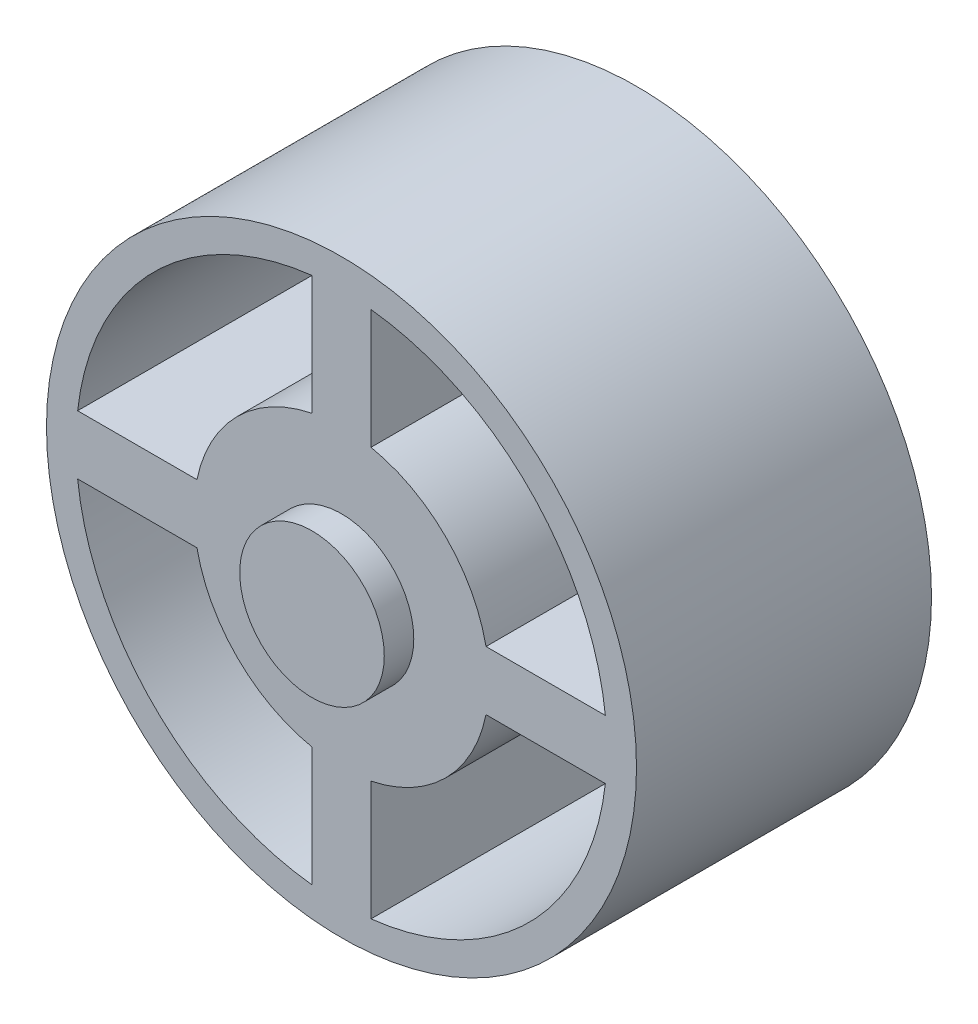
ISO-10303-21;
HEADER;
FILE_DESCRIPTION(('STEP AP214'),'2;1');
FILE_NAME('part.step','',(''),(''),'','','');
FILE_SCHEMA(('AUTOMOTIVE_DESIGN { 1 0 10303 214 1 1 1 1 }'));
ENDSEC;
DATA;
#1=APPLICATION_CONTEXT('core data for automotive mechanical design processes');
#2=APPLICATION_PROTOCOL_DEFINITION('international standard','automotive_design',2000,#1);
#3=PRODUCT_CONTEXT('',#1,'mechanical');
#4=PRODUCT('Part','Part','',(#3));
#5=PRODUCT_RELATED_PRODUCT_CATEGORY('part','',(#4));
#6=PRODUCT_DEFINITION_FORMATION('','',#4);
#7=PRODUCT_DEFINITION_CONTEXT('part definition',#1,'design');
#8=PRODUCT_DEFINITION('design','',#6,#7);
#9=PRODUCT_DEFINITION_SHAPE('','',#8);
#10=(LENGTH_UNIT() NAMED_UNIT(*) SI_UNIT(.MILLI.,.METRE.));
#11=(NAMED_UNIT(*) PLANE_ANGLE_UNIT() SI_UNIT($,.RADIAN.));
#12=(NAMED_UNIT(*) SI_UNIT($,.STERADIAN.) SOLID_ANGLE_UNIT());
#13=UNCERTAINTY_MEASURE_WITH_UNIT(LENGTH_MEASURE(1.E-05),#10,'distance_accuracy_value','');
#14=(GEOMETRIC_REPRESENTATION_CONTEXT(3) GLOBAL_UNCERTAINTY_ASSIGNED_CONTEXT((#13)) GLOBAL_UNIT_ASSIGNED_CONTEXT((#10,
#11,#12)) REPRESENTATION_CONTEXT('',''));
#15=CARTESIAN_POINT('',(0.,0.,0.));
#16=DIRECTION('',(0.,0.,1.));
#17=DIRECTION('',(1.,0.,0.));
#18=AXIS2_PLACEMENT_3D('',#15,#16,#17);
#19=CARTESIAN_POINT('',(0.,0.,100.));
#20=DIRECTION('',(0.,0.,1.));
#21=DIRECTION('',(1.,0.,0.));
#22=AXIS2_PLACEMENT_3D('',#19,#20,#21);
#23=PLANE('',#22);
#24=CARTESIAN_POINT('',(0.,0.,100.));
#25=DIRECTION('',(0.,0.,1.));
#26=DIRECTION('',(1.,0.,0.));
#27=AXIS2_PLACEMENT_3D('',#24,#25,#26);
#28=CIRCLE('',#27,24.5);
#29=CARTESIAN_POINT('',(24.5,0.,100.));
#30=VERTEX_POINT('',#29);
#31=EDGE_CURVE('E11',#30,#30,#28,.T.);
#32=ORIENTED_EDGE('',*,*,#31,.F.);
#33=EDGE_LOOP('',(#32));
#34=FACE_BOUND('',#33,.T.);
#35=CARTESIAN_POINT('',(0.,0.,100.));
#36=DIRECTION('',(0.,0.,1.));
#37=DIRECTION('',(1.,0.,0.));
#38=AXIS2_PLACEMENT_3D('',#35,#36,#37);
#39=CIRCLE('',#38,100.);
#40=CARTESIAN_POINT('',(100.,0.,100.));
#41=VERTEX_POINT('',#40);
#42=EDGE_CURVE('E45',#41,#41,#39,.T.);
#43=ORIENTED_EDGE('',*,*,#42,.T.);
#44=EDGE_LOOP('',(#43));
#45=FACE_BOUND('',#44,.T.);
#46=DIRECTION('',(1.,0.,0.));
#47=VECTOR('',#46,1.);
#48=CARTESIAN_POINT('',(89.4427190999916,9.99999999999969,100.));
#49=LINE('',#48,#47);
#50=CARTESIAN_POINT('',(48.9897948556636,9.99999999999983,100.));
#51=VERTEX_POINT('',#50);
#52=CARTESIAN_POINT('',(89.4427190999916,9.99999999999969,100.));
#53=VERTEX_POINT('',#52);
#54=EDGE_CURVE('E251',#51,#53,#49,.T.);
#55=ORIENTED_EDGE('',*,*,#54,.F.);
#56=CARTESIAN_POINT('',(0.,0.,100.));
#57=DIRECTION('',(0.,0.,-1.));
#58=DIRECTION('',(1.,0.,0.));
#59=AXIS2_PLACEMENT_3D('',#56,#57,#58);
#60=CIRCLE('',#59,50.);
#61=CARTESIAN_POINT('',(10.,48.9897948556636,100.));
#62=VERTEX_POINT('',#61);
#63=EDGE_CURVE('E249',#62,#51,#60,.T.);
#64=ORIENTED_EDGE('',*,*,#63,.F.);
#65=DIRECTION('',(0.,-1.,0.));
#66=VECTOR('',#65,1.);
#67=CARTESIAN_POINT('',(10.,89.4427190999916,100.));
#68=LINE('',#67,#66);
#69=CARTESIAN_POINT('',(10.,89.4427190999916,100.));
#70=VERTEX_POINT('',#69);
#71=EDGE_CURVE('E257',#70,#62,#68,.T.);
#72=ORIENTED_EDGE('',*,*,#71,.F.);
#73=CARTESIAN_POINT('',(0.,0.,100.));
#74=DIRECTION('',(0.,0.,1.));
#75=DIRECTION('',(1.,0.,0.));
#76=AXIS2_PLACEMENT_3D('',#73,#74,#75);
#77=CIRCLE('',#76,90.);
#78=EDGE_CURVE('E254',#53,#70,#77,.T.);
#79=ORIENTED_EDGE('',*,*,#78,.F.);
#80=EDGE_LOOP('',(#55,#64,#72,#79));
#81=FACE_BOUND('',#80,.T.);
#82=DIRECTION('',(0.,1.,0.));
#83=VECTOR('',#82,1.);
#84=CARTESIAN_POINT('',(-10.,89.4427190999916,100.));
#85=LINE('',#84,#83);
#86=CARTESIAN_POINT('',(-10.,48.9897948556636,100.));
#87=VERTEX_POINT('',#86);
#88=CARTESIAN_POINT('',(-10.,89.4427190999916,100.));
#89=VERTEX_POINT('',#88);
#90=EDGE_CURVE('E220',#87,#89,#85,.T.);
#91=ORIENTED_EDGE('',*,*,#90,.F.);
#92=CARTESIAN_POINT('',(0.,0.,100.));
#93=DIRECTION('',(0.,0.,-1.));
#94=DIRECTION('',(1.,0.,0.));
#95=AXIS2_PLACEMENT_3D('',#92,#93,#94);
#96=CIRCLE('',#95,50.);
#97=CARTESIAN_POINT('',(-48.9897948556635,10.0000000000005,100.));
#98=VERTEX_POINT('',#97);
#99=EDGE_CURVE('E218',#98,#87,#96,.T.);
#100=ORIENTED_EDGE('',*,*,#99,.F.);
#101=DIRECTION('',(1.,0.,0.));
#102=VECTOR('',#101,1.);
#103=CARTESIAN_POINT('',(-89.4427190999915,10.0000000000009,100.));
#104=LINE('',#103,#102);
#105=CARTESIAN_POINT('',(-89.4427190999915,10.0000000000009,100.));
#106=VERTEX_POINT('',#105);
#107=EDGE_CURVE('E226',#106,#98,#104,.T.);
#108=ORIENTED_EDGE('',*,*,#107,.F.);
#109=CARTESIAN_POINT('',(0.,0.,100.));
#110=DIRECTION('',(0.,0.,1.));
#111=DIRECTION('',(1.,0.,0.));
#112=AXIS2_PLACEMENT_3D('',#109,#110,#111);
#113=CIRCLE('',#112,90.);
#114=EDGE_CURVE('E223',#89,#106,#113,.T.);
#115=ORIENTED_EDGE('',*,*,#114,.F.);
#116=EDGE_LOOP('',(#91,#100,#108,#115));
#117=FACE_BOUND('',#116,.T.);
#118=DIRECTION('',(0.,-1.,0.));
#119=VECTOR('',#118,1.);
#120=CARTESIAN_POINT('',(9.99999999999938,-89.4427190999917,100.));
#121=LINE('',#120,#119);
#122=CARTESIAN_POINT('',(9.99999999999966,-48.9897948556636,100.));
#123=VERTEX_POINT('',#122);
#124=CARTESIAN_POINT('',(9.99999999999931,-89.4427190999917,100.));
#125=VERTEX_POINT('',#124);
#126=EDGE_CURVE('E189',#123,#125,#121,.T.);
#127=ORIENTED_EDGE('',*,*,#126,.F.);
#128=CARTESIAN_POINT('',(0.,0.,100.));
#129=DIRECTION('',(0.,0.,-1.));
#130=DIRECTION('',(1.,0.,0.));
#131=AXIS2_PLACEMENT_3D('',#128,#129,#130);
#132=CIRCLE('',#131,50.);
#133=CARTESIAN_POINT('',(48.9897948556635,-10.0000000000002,100.));
#134=VERTEX_POINT('',#133);
#135=EDGE_CURVE('E187',#134,#123,#132,.T.);
#136=ORIENTED_EDGE('',*,*,#135,.F.);
#137=DIRECTION('',(-1.,0.,0.));
#138=VECTOR('',#137,1.);
#139=CARTESIAN_POINT('',(89.4427190999916,-10.0000000000003,100.));
#140=LINE('',#139,#138);
#141=CARTESIAN_POINT('',(89.4427190999916,-10.0000000000003,100.));
#142=VERTEX_POINT('',#141);
#143=EDGE_CURVE('E195',#142,#134,#140,.T.);
#144=ORIENTED_EDGE('',*,*,#143,.F.);
#145=CARTESIAN_POINT('',(0.,0.,100.));
#146=DIRECTION('',(0.,0.,1.));
#147=DIRECTION('',(1.,0.,0.));
#148=AXIS2_PLACEMENT_3D('',#145,#146,#147);
#149=CIRCLE('',#148,90.);
#150=EDGE_CURVE('E192',#125,#142,#149,.T.);
#151=ORIENTED_EDGE('',*,*,#150,.F.);
#152=EDGE_LOOP('',(#127,#136,#144,#151));
#153=FACE_BOUND('',#152,.T.);
#154=DIRECTION('',(-1.,0.,0.));
#155=VECTOR('',#154,1.);
#156=CARTESIAN_POINT('',(-89.4427190999917,-9.99999999999906,100.));
#157=LINE('',#156,#155);
#158=CARTESIAN_POINT('',(-48.9897948556637,-9.99999999999949,100.));
#159=VERTEX_POINT('',#158);
#160=CARTESIAN_POINT('',(-89.4427190999917,-9.99999999999904,100.));
#161=VERTEX_POINT('',#160);
#162=EDGE_CURVE('E159',#159,#161,#157,.T.);
#163=ORIENTED_EDGE('',*,*,#162,.F.);
#164=CARTESIAN_POINT('',(0.,0.,100.));
#165=DIRECTION('',(0.,0.,-1.));
#166=DIRECTION('',(1.,0.,0.));
#167=AXIS2_PLACEMENT_3D('',#164,#165,#166);
#168=CIRCLE('',#167,50.);
#169=CARTESIAN_POINT('',(-10.0000000000003,-48.9897948556635,100.));
#170=VERTEX_POINT('',#169);
#171=EDGE_CURVE('E151',#170,#159,#168,.T.);
#172=ORIENTED_EDGE('',*,*,#171,.F.);
#173=DIRECTION('',(0.,1.,0.));
#174=VECTOR('',#173,1.);
#175=CARTESIAN_POINT('',(-10.0000000000006,-89.4427190999915,100.));
#176=LINE('',#175,#174);
#177=CARTESIAN_POINT('',(-10.0000000000006,-89.4427190999915,100.));
#178=VERTEX_POINT('',#177);
#179=EDGE_CURVE('E173',#178,#170,#176,.T.);
#180=ORIENTED_EDGE('',*,*,#179,.F.);
#181=CARTESIAN_POINT('',(0.,0.,100.));
#182=DIRECTION('',(0.,0.,1.));
#183=DIRECTION('',(1.,0.,0.));
#184=AXIS2_PLACEMENT_3D('',#181,#182,#183);
#185=CIRCLE('',#184,90.);
#186=EDGE_CURVE('E171',#161,#178,#185,.T.);
#187=ORIENTED_EDGE('',*,*,#186,.F.);
#188=EDGE_LOOP('',(#163,#172,#180,#187));
#189=FACE_BOUND('',#188,.T.);
#190=ADVANCED_FACE('F36',(#34,#45,#81,#117,#153,#189),#23,.T.);
#191=CARTESIAN_POINT('',(0.,0.,0.));
#192=DIRECTION('',(0.,0.,1.));
#193=DIRECTION('',(1.,0.,0.));
#194=AXIS2_PLACEMENT_3D('',#191,#192,#193);
#195=PLANE('',#194);
#196=CARTESIAN_POINT('',(0.,0.,0.));
#197=DIRECTION('',(0.,0.,1.));
#198=DIRECTION('',(1.,0.,0.));
#199=AXIS2_PLACEMENT_3D('',#196,#197,#198);
#200=CIRCLE('',#199,24.5);
#201=CARTESIAN_POINT('',(24.5,0.,0.));
#202=VERTEX_POINT('',#201);
#203=EDGE_CURVE('E40',#202,#202,#200,.T.);
#204=ORIENTED_EDGE('',*,*,#203,.T.);
#205=EDGE_LOOP('',(#204));
#206=FACE_BOUND('',#205,.T.);
#207=CARTESIAN_POINT('',(0.,0.,0.));
#208=DIRECTION('',(0.,0.,-1.));
#209=DIRECTION('',(1.,0.,0.));
#210=AXIS2_PLACEMENT_3D('',#207,#208,#209);
#211=CIRCLE('',#210,50.);
#212=CARTESIAN_POINT('',(48.9897948556635,-10.0000000000002,0.));
#213=VERTEX_POINT('',#212);
#214=CARTESIAN_POINT('',(9.99999999999966,-48.9897948556636,0.));
#215=VERTEX_POINT('',#214);
#216=EDGE_CURVE('E167',#213,#215,#211,.T.);
#217=ORIENTED_EDGE('',*,*,#216,.T.);
#218=DIRECTION('',(0.,-1.,0.));
#219=VECTOR('',#218,1.);
#220=CARTESIAN_POINT('',(9.99999999999938,-89.4427190999917,0.));
#221=LINE('',#220,#219);
#222=CARTESIAN_POINT('',(9.99999999999931,-89.4427190999917,0.));
#223=VERTEX_POINT('',#222);
#224=EDGE_CURVE('E200',#215,#223,#221,.T.);
#225=ORIENTED_EDGE('',*,*,#224,.T.);
#226=CARTESIAN_POINT('',(0.,0.,0.));
#227=DIRECTION('',(0.,0.,1.));
#228=DIRECTION('',(1.,0.,0.));
#229=AXIS2_PLACEMENT_3D('',#226,#227,#228);
#230=CIRCLE('',#229,90.);
#231=CARTESIAN_POINT('',(89.4427190999916,-10.0000000000003,0.));
#232=VERTEX_POINT('',#231);
#233=EDGE_CURVE('E203',#223,#232,#230,.T.);
#234=ORIENTED_EDGE('',*,*,#233,.T.);
#235=DIRECTION('',(-1.,0.,0.));
#236=VECTOR('',#235,1.);
#237=CARTESIAN_POINT('',(89.4427190999916,-10.0000000000003,0.));
#238=LINE('',#237,#236);
#239=EDGE_CURVE('E190',#232,#213,#238,.T.);
#240=ORIENTED_EDGE('',*,*,#239,.T.);
#241=EDGE_LOOP('',(#217,#225,#234,#240));
#242=FACE_BOUND('',#241,.T.);
#243=CARTESIAN_POINT('',(0.,0.,0.));
#244=DIRECTION('',(0.,0.,-1.));
#245=DIRECTION('',(1.,0.,0.));
#246=AXIS2_PLACEMENT_3D('',#243,#244,#245);
#247=CIRCLE('',#246,50.);
#248=CARTESIAN_POINT('',(10.,48.9897948556636,0.));
#249=VERTEX_POINT('',#248);
#250=CARTESIAN_POINT('',(48.9897948556636,9.99999999999983,0.));
#251=VERTEX_POINT('',#250);
#252=EDGE_CURVE('E248',#249,#251,#247,.T.);
#253=ORIENTED_EDGE('',*,*,#252,.T.);
#254=DIRECTION('',(1.,0.,0.));
#255=VECTOR('',#254,1.);
#256=CARTESIAN_POINT('',(89.4427190999916,9.99999999999969,0.));
#257=LINE('',#256,#255);
#258=CARTESIAN_POINT('',(89.4427190999916,9.99999999999969,0.));
#259=VERTEX_POINT('',#258);
#260=EDGE_CURVE('E262',#251,#259,#257,.T.);
#261=ORIENTED_EDGE('',*,*,#260,.T.);
#262=CARTESIAN_POINT('',(0.,0.,0.));
#263=DIRECTION('',(0.,0.,1.));
#264=DIRECTION('',(1.,0.,0.));
#265=AXIS2_PLACEMENT_3D('',#262,#263,#264);
#266=CIRCLE('',#265,90.);
#267=CARTESIAN_POINT('',(10.,89.4427190999916,0.));
#268=VERTEX_POINT('',#267);
#269=EDGE_CURVE('E265',#259,#268,#266,.T.);
#270=ORIENTED_EDGE('',*,*,#269,.T.);
#271=DIRECTION('',(0.,-1.,0.));
#272=VECTOR('',#271,1.);
#273=CARTESIAN_POINT('',(10.,89.4427190999916,0.));
#274=LINE('',#273,#272);
#275=EDGE_CURVE('E252',#268,#249,#274,.T.);
#276=ORIENTED_EDGE('',*,*,#275,.T.);
#277=EDGE_LOOP('',(#253,#261,#270,#276));
#278=FACE_BOUND('',#277,.T.);
#279=CARTESIAN_POINT('',(0.,0.,0.));
#280=DIRECTION('',(0.,0.,1.));
#281=DIRECTION('',(1.,0.,0.));
#282=AXIS2_PLACEMENT_3D('',#279,#280,#281);
#283=CIRCLE('',#282,100.);
#284=CARTESIAN_POINT('',(100.,0.,0.));
#285=VERTEX_POINT('',#284);
#286=EDGE_CURVE('E279',#285,#285,#283,.T.);
#287=ORIENTED_EDGE('',*,*,#286,.F.);
#288=EDGE_LOOP('',(#287));
#289=FACE_BOUND('',#288,.T.);
#290=CARTESIAN_POINT('',(0.,0.,0.));
#291=DIRECTION('',(0.,0.,-1.));
#292=DIRECTION('',(1.,0.,0.));
#293=AXIS2_PLACEMENT_3D('',#290,#291,#292);
#294=CIRCLE('',#293,50.);
#295=CARTESIAN_POINT('',(-48.9897948556635,10.0000000000005,0.));
#296=VERTEX_POINT('',#295);
#297=CARTESIAN_POINT('',(-10.,48.9897948556636,0.));
#298=VERTEX_POINT('',#297);
#299=EDGE_CURVE('E217',#296,#298,#294,.T.);
#300=ORIENTED_EDGE('',*,*,#299,.T.);
#301=DIRECTION('',(0.,1.,0.));
#302=VECTOR('',#301,1.);
#303=CARTESIAN_POINT('',(-10.,89.4427190999916,0.));
#304=LINE('',#303,#302);
#305=CARTESIAN_POINT('',(-10.,89.4427190999916,0.));
#306=VERTEX_POINT('',#305);
#307=EDGE_CURVE('E231',#298,#306,#304,.T.);
#308=ORIENTED_EDGE('',*,*,#307,.T.);
#309=CARTESIAN_POINT('',(0.,0.,0.));
#310=DIRECTION('',(0.,0.,1.));
#311=DIRECTION('',(1.,0.,0.));
#312=AXIS2_PLACEMENT_3D('',#309,#310,#311);
#313=CIRCLE('',#312,90.);
#314=CARTESIAN_POINT('',(-89.4427190999915,10.0000000000009,0.));
#315=VERTEX_POINT('',#314);
#316=EDGE_CURVE('E234',#306,#315,#313,.T.);
#317=ORIENTED_EDGE('',*,*,#316,.T.);
#318=DIRECTION('',(1.,0.,0.));
#319=VECTOR('',#318,1.);
#320=CARTESIAN_POINT('',(-89.4427190999915,10.0000000000009,0.));
#321=LINE('',#320,#319);
#322=EDGE_CURVE('E221',#315,#296,#321,.T.);
#323=ORIENTED_EDGE('',*,*,#322,.T.);
#324=EDGE_LOOP('',(#300,#308,#317,#323));
#325=FACE_BOUND('',#324,.T.);
#326=CARTESIAN_POINT('',(0.,0.,0.));
#327=DIRECTION('',(0.,0.,-1.));
#328=DIRECTION('',(1.,0.,0.));
#329=AXIS2_PLACEMENT_3D('',#326,#327,#328);
#330=CIRCLE('',#329,50.);
#331=CARTESIAN_POINT('',(-10.0000000000003,-48.9897948556635,0.));
#332=VERTEX_POINT('',#331);
#333=CARTESIAN_POINT('',(-48.9897948556637,-9.99999999999949,0.));
#334=VERTEX_POINT('',#333);
#335=EDGE_CURVE('E61',#332,#334,#330,.T.);
#336=ORIENTED_EDGE('',*,*,#335,.T.);
#337=DIRECTION('',(-1.,0.,0.));
#338=VECTOR('',#337,1.);
#339=CARTESIAN_POINT('',(-89.4427190999917,-9.99999999999906,0.));
#340=LINE('',#339,#338);
#341=CARTESIAN_POINT('',(-89.4427190999917,-9.99999999999904,0.));
#342=VERTEX_POINT('',#341);
#343=EDGE_CURVE('E166',#334,#342,#340,.T.);
#344=ORIENTED_EDGE('',*,*,#343,.T.);
#345=CARTESIAN_POINT('',(0.,0.,0.));
#346=DIRECTION('',(0.,0.,1.));
#347=DIRECTION('',(1.,0.,0.));
#348=AXIS2_PLACEMENT_3D('',#345,#346,#347);
#349=CIRCLE('',#348,90.);
#350=CARTESIAN_POINT('',(-10.0000000000006,-89.4427190999915,0.));
#351=VERTEX_POINT('',#350);
#352=EDGE_CURVE('E179',#342,#351,#349,.T.);
#353=ORIENTED_EDGE('',*,*,#352,.T.);
#354=DIRECTION('',(0.,1.,0.));
#355=VECTOR('',#354,1.);
#356=CARTESIAN_POINT('',(-10.0000000000006,-89.4427190999915,0.));
#357=LINE('',#356,#355);
#358=EDGE_CURVE('E160',#351,#332,#357,.T.);
#359=ORIENTED_EDGE('',*,*,#358,.T.);
#360=EDGE_LOOP('',(#336,#344,#353,#359));
#361=FACE_BOUND('',#360,.T.);
#362=ADVANCED_FACE('F285',(#206,#242,#278,#289,#325,#361),#195,.F.);
#363=CARTESIAN_POINT('',(0.,0.,100.));
#364=DIRECTION('',(0.,0.,-1.));
#365=DIRECTION('',(-1.,0.,0.));
#366=AXIS2_PLACEMENT_3D('',#363,#364,#365);
#367=CYLINDRICAL_SURFACE('',#366,100.);
#368=ORIENTED_EDGE('',*,*,#42,.F.);
#369=EDGE_LOOP('',(#368));
#370=FACE_BOUND('',#369,.T.);
#371=ORIENTED_EDGE('',*,*,#286,.T.);
#372=EDGE_LOOP('',(#371));
#373=FACE_BOUND('',#372,.T.);
#374=ADVANCED_FACE('F38',(#370,#373),#367,.T.);
#375=CARTESIAN_POINT('',(0.,0.,100.));
#376=DIRECTION('',(0.,0.,-1.));
#377=DIRECTION('',(-1.,0.,0.));
#378=AXIS2_PLACEMENT_3D('',#375,#376,#377);
#379=CYLINDRICAL_SURFACE('',#378,50.);
#380=ORIENTED_EDGE('',*,*,#252,.F.);
#381=DIRECTION('',(0.,0.,-1.));
#382=VECTOR('',#381,1.);
#383=CARTESIAN_POINT('',(10.,48.9897948556636,100.));
#384=LINE('',#383,#382);
#385=EDGE_CURVE('E259',#62,#249,#384,.T.);
#386=ORIENTED_EDGE('',*,*,#385,.F.);
#387=ORIENTED_EDGE('',*,*,#63,.T.);
#388=DIRECTION('',(0.,0.,-1.));
#389=VECTOR('',#388,1.);
#390=CARTESIAN_POINT('',(48.9897948556636,9.99999999999983,100.));
#391=LINE('',#390,#389);
#392=EDGE_CURVE('E276',#51,#251,#391,.T.);
#393=ORIENTED_EDGE('',*,*,#392,.T.);
#394=EDGE_LOOP('',(#380,#386,#387,#393));
#395=FACE_BOUND('',#394,.T.);
#396=ADVANCED_FACE('F314',(#395),#379,.T.);
#397=CARTESIAN_POINT('',(89.4427190999916,9.99999999999969,100.));
#398=DIRECTION('',(0.,1.,0.));
#399=DIRECTION('',(-1.,0.,0.));
#400=AXIS2_PLACEMENT_3D('',#397,#398,#399);
#401=PLANE('',#400);
#402=ORIENTED_EDGE('',*,*,#260,.F.);
#403=ORIENTED_EDGE('',*,*,#392,.F.);
#404=ORIENTED_EDGE('',*,*,#54,.T.);
#405=DIRECTION('',(0.,0.,-1.));
#406=VECTOR('',#405,1.);
#407=CARTESIAN_POINT('',(89.4427190999916,9.99999999999969,100.));
#408=LINE('',#407,#406);
#409=EDGE_CURVE('E274',#53,#259,#408,.T.);
#410=ORIENTED_EDGE('',*,*,#409,.T.);
#411=EDGE_LOOP('',(#402,#403,#404,#410));
#412=FACE_BOUND('',#411,.T.);
#413=ADVANCED_FACE('F317',(#412),#401,.T.);
#414=CARTESIAN_POINT('',(0.,0.,100.));
#415=DIRECTION('',(0.,0.,-1.));
#416=DIRECTION('',(-1.,0.,0.));
#417=AXIS2_PLACEMENT_3D('',#414,#415,#416);
#418=CYLINDRICAL_SURFACE('',#417,90.);
#419=ORIENTED_EDGE('',*,*,#269,.F.);
#420=ORIENTED_EDGE('',*,*,#409,.F.);
#421=ORIENTED_EDGE('',*,*,#78,.T.);
#422=DIRECTION('',(0.,0.,-1.));
#423=VECTOR('',#422,1.);
#424=CARTESIAN_POINT('',(10.,89.4427190999916,100.));
#425=LINE('',#424,#423);
#426=EDGE_CURVE('E272',#70,#268,#425,.T.);
#427=ORIENTED_EDGE('',*,*,#426,.T.);
#428=EDGE_LOOP('',(#419,#420,#421,#427));
#429=FACE_BOUND('',#428,.T.);
#430=ADVANCED_FACE('F321',(#429),#418,.F.);
#431=CARTESIAN_POINT('',(10.,89.4427190999916,100.));
#432=DIRECTION('',(1.,0.,0.));
#433=DIRECTION('',(0.,0.,-1.));
#434=AXIS2_PLACEMENT_3D('',#431,#432,#433);
#435=PLANE('',#434);
#436=ORIENTED_EDGE('',*,*,#275,.F.);
#437=ORIENTED_EDGE('',*,*,#426,.F.);
#438=ORIENTED_EDGE('',*,*,#71,.T.);
#439=ORIENTED_EDGE('',*,*,#385,.T.);
#440=EDGE_LOOP('',(#436,#437,#438,#439));
#441=FACE_BOUND('',#440,.T.);
#442=ADVANCED_FACE('F325',(#441),#435,.T.);
#443=CARTESIAN_POINT('',(0.,0.,100.));
#444=DIRECTION('',(0.,0.,-1.));
#445=DIRECTION('',(-1.,0.,0.));
#446=AXIS2_PLACEMENT_3D('',#443,#444,#445);
#447=CYLINDRICAL_SURFACE('',#446,50.);
#448=ORIENTED_EDGE('',*,*,#299,.F.);
#449=DIRECTION('',(0.,0.,-1.));
#450=VECTOR('',#449,1.);
#451=CARTESIAN_POINT('',(-48.9897948556635,10.0000000000005,100.));
#452=LINE('',#451,#450);
#453=EDGE_CURVE('E228',#98,#296,#452,.T.);
#454=ORIENTED_EDGE('',*,*,#453,.F.);
#455=ORIENTED_EDGE('',*,*,#99,.T.);
#456=DIRECTION('',(0.,0.,-1.));
#457=VECTOR('',#456,1.);
#458=CARTESIAN_POINT('',(-10.,48.9897948556636,100.));
#459=LINE('',#458,#457);
#460=EDGE_CURVE('E245',#87,#298,#459,.T.);
#461=ORIENTED_EDGE('',*,*,#460,.T.);
#462=EDGE_LOOP('',(#448,#454,#455,#461));
#463=FACE_BOUND('',#462,.T.);
#464=ADVANCED_FACE('F329',(#463),#447,.T.);
#465=CARTESIAN_POINT('',(-10.,89.4427190999916,100.));
#466=DIRECTION('',(-1.,0.,0.));
#467=DIRECTION('',(0.,0.,1.));
#468=AXIS2_PLACEMENT_3D('',#465,#466,#467);
#469=PLANE('',#468);
#470=ORIENTED_EDGE('',*,*,#307,.F.);
#471=ORIENTED_EDGE('',*,*,#460,.F.);
#472=ORIENTED_EDGE('',*,*,#90,.T.);
#473=DIRECTION('',(0.,0.,-1.));
#474=VECTOR('',#473,1.);
#475=CARTESIAN_POINT('',(-10.,89.4427190999916,100.));
#476=LINE('',#475,#474);
#477=EDGE_CURVE('E243',#89,#306,#476,.T.);
#478=ORIENTED_EDGE('',*,*,#477,.T.);
#479=EDGE_LOOP('',(#470,#471,#472,#478));
#480=FACE_BOUND('',#479,.T.);
#481=ADVANCED_FACE('F333',(#480),#469,.T.);
#482=CARTESIAN_POINT('',(0.,0.,100.));
#483=DIRECTION('',(0.,0.,-1.));
#484=DIRECTION('',(-1.,0.,0.));
#485=AXIS2_PLACEMENT_3D('',#482,#483,#484);
#486=CYLINDRICAL_SURFACE('',#485,90.);
#487=ORIENTED_EDGE('',*,*,#316,.F.);
#488=ORIENTED_EDGE('',*,*,#477,.F.);
#489=ORIENTED_EDGE('',*,*,#114,.T.);
#490=DIRECTION('',(0.,0.,-1.));
#491=VECTOR('',#490,1.);
#492=CARTESIAN_POINT('',(-89.4427190999915,10.0000000000009,100.));
#493=LINE('',#492,#491);
#494=EDGE_CURVE('E241',#106,#315,#493,.T.);
#495=ORIENTED_EDGE('',*,*,#494,.T.);
#496=EDGE_LOOP('',(#487,#488,#489,#495));
#497=FACE_BOUND('',#496,.T.);
#498=ADVANCED_FACE('F337',(#497),#486,.F.);
#499=CARTESIAN_POINT('',(-89.4427190999915,10.0000000000009,100.));
#500=DIRECTION('',(0.,1.,0.));
#501=DIRECTION('',(-1.,0.,0.));
#502=AXIS2_PLACEMENT_3D('',#499,#500,#501);
#503=PLANE('',#502);
#504=ORIENTED_EDGE('',*,*,#322,.F.);
#505=ORIENTED_EDGE('',*,*,#494,.F.);
#506=ORIENTED_EDGE('',*,*,#107,.T.);
#507=ORIENTED_EDGE('',*,*,#453,.T.);
#508=EDGE_LOOP('',(#504,#505,#506,#507));
#509=FACE_BOUND('',#508,.T.);
#510=ADVANCED_FACE('F341',(#509),#503,.T.);
#511=CARTESIAN_POINT('',(0.,0.,100.));
#512=DIRECTION('',(0.,0.,-1.));
#513=DIRECTION('',(-1.,0.,0.));
#514=AXIS2_PLACEMENT_3D('',#511,#512,#513);
#515=CYLINDRICAL_SURFACE('',#514,50.);
#516=ORIENTED_EDGE('',*,*,#216,.F.);
#517=DIRECTION('',(0.,0.,-1.));
#518=VECTOR('',#517,1.);
#519=CARTESIAN_POINT('',(48.9897948556635,-10.0000000000002,100.));
#520=LINE('',#519,#518);
#521=EDGE_CURVE('E197',#134,#213,#520,.T.);
#522=ORIENTED_EDGE('',*,*,#521,.F.);
#523=ORIENTED_EDGE('',*,*,#135,.T.);
#524=DIRECTION('',(0.,0.,-1.));
#525=VECTOR('',#524,1.);
#526=CARTESIAN_POINT('',(9.99999999999966,-48.9897948556636,100.));
#527=LINE('',#526,#525);
#528=EDGE_CURVE('E214',#123,#215,#527,.T.);
#529=ORIENTED_EDGE('',*,*,#528,.T.);
#530=EDGE_LOOP('',(#516,#522,#523,#529));
#531=FACE_BOUND('',#530,.T.);
#532=ADVANCED_FACE('F345',(#531),#515,.T.);
#533=CARTESIAN_POINT('',(9.99999999999938,-89.4427190999917,100.));
#534=DIRECTION('',(1.,0.,0.));
#535=DIRECTION('',(0.,1.,0.));
#536=AXIS2_PLACEMENT_3D('',#533,#534,#535);
#537=PLANE('',#536);
#538=ORIENTED_EDGE('',*,*,#224,.F.);
#539=ORIENTED_EDGE('',*,*,#528,.F.);
#540=ORIENTED_EDGE('',*,*,#126,.T.);
#541=DIRECTION('',(0.,0.,-1.));
#542=VECTOR('',#541,1.);
#543=CARTESIAN_POINT('',(9.99999999999931,-89.4427190999917,100.));
#544=LINE('',#543,#542);
#545=EDGE_CURVE('E212',#125,#223,#544,.T.);
#546=ORIENTED_EDGE('',*,*,#545,.T.);
#547=EDGE_LOOP('',(#538,#539,#540,#546));
#548=FACE_BOUND('',#547,.T.);
#549=ADVANCED_FACE('F349',(#548),#537,.T.);
#550=CARTESIAN_POINT('',(0.,0.,100.));
#551=DIRECTION('',(0.,0.,-1.));
#552=DIRECTION('',(-1.,0.,0.));
#553=AXIS2_PLACEMENT_3D('',#550,#551,#552);
#554=CYLINDRICAL_SURFACE('',#553,90.);
#555=ORIENTED_EDGE('',*,*,#233,.F.);
#556=ORIENTED_EDGE('',*,*,#545,.F.);
#557=ORIENTED_EDGE('',*,*,#150,.T.);
#558=DIRECTION('',(0.,0.,-1.));
#559=VECTOR('',#558,1.);
#560=CARTESIAN_POINT('',(89.4427190999916,-10.0000000000003,100.));
#561=LINE('',#560,#559);
#562=EDGE_CURVE('E210',#142,#232,#561,.T.);
#563=ORIENTED_EDGE('',*,*,#562,.T.);
#564=EDGE_LOOP('',(#555,#556,#557,#563));
#565=FACE_BOUND('',#564,.T.);
#566=ADVANCED_FACE('F353',(#565),#554,.F.);
#567=CARTESIAN_POINT('',(89.4427190999916,-10.0000000000003,100.));
#568=DIRECTION('',(0.,-1.,0.));
#569=DIRECTION('',(1.,0.,0.));
#570=AXIS2_PLACEMENT_3D('',#567,#568,#569);
#571=PLANE('',#570);
#572=ORIENTED_EDGE('',*,*,#239,.F.);
#573=ORIENTED_EDGE('',*,*,#562,.F.);
#574=ORIENTED_EDGE('',*,*,#143,.T.);
#575=ORIENTED_EDGE('',*,*,#521,.T.);
#576=EDGE_LOOP('',(#572,#573,#574,#575));
#577=FACE_BOUND('',#576,.T.);
#578=ADVANCED_FACE('F357',(#577),#571,.T.);
#579=CARTESIAN_POINT('',(0.,0.,100.));
#580=DIRECTION('',(0.,0.,-1.));
#581=DIRECTION('',(-1.,0.,0.));
#582=AXIS2_PLACEMENT_3D('',#579,#580,#581);
#583=CYLINDRICAL_SURFACE('',#582,50.);
#584=ORIENTED_EDGE('',*,*,#335,.F.);
#585=DIRECTION('',(0.,0.,-1.));
#586=VECTOR('',#585,1.);
#587=CARTESIAN_POINT('',(-10.0000000000003,-48.9897948556635,100.));
#588=LINE('',#587,#586);
#589=EDGE_CURVE('E155',#170,#332,#588,.T.);
#590=ORIENTED_EDGE('',*,*,#589,.F.);
#591=ORIENTED_EDGE('',*,*,#171,.T.);
#592=DIRECTION('',(0.,0.,-1.));
#593=VECTOR('',#592,1.);
#594=CARTESIAN_POINT('',(-48.9897948556637,-9.99999999999949,100.));
#595=LINE('',#594,#593);
#596=EDGE_CURVE('E154',#159,#334,#595,.T.);
#597=ORIENTED_EDGE('',*,*,#596,.T.);
#598=EDGE_LOOP('',(#584,#590,#591,#597));
#599=FACE_BOUND('',#598,.T.);
#600=ADVANCED_FACE('F153',(#599),#583,.T.);
#601=CARTESIAN_POINT('',(-89.4427190999917,-9.99999999999906,100.));
#602=DIRECTION('',(0.,-1.,0.));
#603=DIRECTION('',(1.,0.,0.));
#604=AXIS2_PLACEMENT_3D('',#601,#602,#603);
#605=PLANE('',#604);
#606=ORIENTED_EDGE('',*,*,#343,.F.);
#607=ORIENTED_EDGE('',*,*,#596,.F.);
#608=ORIENTED_EDGE('',*,*,#162,.T.);
#609=DIRECTION('',(0.,0.,-1.));
#610=VECTOR('',#609,1.);
#611=CARTESIAN_POINT('',(-89.4427190999917,-9.99999999999904,100.));
#612=LINE('',#611,#610);
#613=EDGE_CURVE('E168',#161,#342,#612,.T.);
#614=ORIENTED_EDGE('',*,*,#613,.T.);
#615=EDGE_LOOP('',(#606,#607,#608,#614));
#616=FACE_BOUND('',#615,.T.);
#617=ADVANCED_FACE('F163',(#616),#605,.T.);
#618=CARTESIAN_POINT('',(0.,0.,100.));
#619=DIRECTION('',(0.,0.,-1.));
#620=DIRECTION('',(-1.,0.,0.));
#621=AXIS2_PLACEMENT_3D('',#618,#619,#620);
#622=CYLINDRICAL_SURFACE('',#621,90.);
#623=ORIENTED_EDGE('',*,*,#352,.F.);
#624=ORIENTED_EDGE('',*,*,#613,.F.);
#625=ORIENTED_EDGE('',*,*,#186,.T.);
#626=DIRECTION('',(0.,0.,-1.));
#627=VECTOR('',#626,1.);
#628=CARTESIAN_POINT('',(-10.0000000000006,-89.4427190999915,100.));
#629=LINE('',#628,#627);
#630=EDGE_CURVE('E53',#178,#351,#629,.T.);
#631=ORIENTED_EDGE('',*,*,#630,.T.);
#632=EDGE_LOOP('',(#623,#624,#625,#631));
#633=FACE_BOUND('',#632,.T.);
#634=ADVANCED_FACE('F294',(#633),#622,.F.);
#635=CARTESIAN_POINT('',(-10.0000000000006,-89.4427190999915,100.));
#636=DIRECTION('',(-1.,0.,0.));
#637=DIRECTION('',(0.,-1.,0.));
#638=AXIS2_PLACEMENT_3D('',#635,#636,#637);
#639=PLANE('',#638);
#640=ORIENTED_EDGE('',*,*,#358,.F.);
#641=ORIENTED_EDGE('',*,*,#630,.F.);
#642=ORIENTED_EDGE('',*,*,#179,.T.);
#643=ORIENTED_EDGE('',*,*,#589,.T.);
#644=EDGE_LOOP('',(#640,#641,#642,#643));
#645=FACE_BOUND('',#644,.T.);
#646=ADVANCED_FACE('F291',(#645),#639,.T.);
#647=CARTESIAN_POINT('',(0.,0.,-9.99999999999999));
#648=DIRECTION('',(0.,0.,1.));
#649=DIRECTION('',(1.,0.,0.));
#650=AXIS2_PLACEMENT_3D('',#647,#648,#649);
#651=PLANE('',#650);
#652=CARTESIAN_POINT('',(0.,0.,-9.99999999999999));
#653=DIRECTION('',(0.,0.,1.));
#654=DIRECTION('',(1.,0.,0.));
#655=AXIS2_PLACEMENT_3D('',#652,#653,#654);
#656=CIRCLE('',#655,24.5);
#657=CARTESIAN_POINT('',(24.5,0.,-9.99999999999999));
#658=VERTEX_POINT('',#657);
#659=EDGE_CURVE('E430',#658,#658,#656,.T.);
#660=ORIENTED_EDGE('',*,*,#659,.F.);
#661=EDGE_LOOP('',(#660));
#662=FACE_BOUND('',#661,.T.);
#663=ADVANCED_FACE('F293',(#662),#651,.F.);
#664=CARTESIAN_POINT('',(0.,0.,-9.99999999999999));
#665=DIRECTION('',(0.,0.,1.));
#666=DIRECTION('',(1.,0.,0.));
#667=AXIS2_PLACEMENT_3D('',#664,#665,#666);
#668=CYLINDRICAL_SURFACE('',#667,24.5);
#669=ORIENTED_EDGE('',*,*,#659,.T.);
#670=EDGE_LOOP('',(#669));
#671=FACE_BOUND('',#670,.T.);
#672=ORIENTED_EDGE('',*,*,#203,.F.);
#673=EDGE_LOOP('',(#672));
#674=FACE_BOUND('',#673,.T.);
#675=ADVANCED_FACE('F300',(#671,#674),#668,.T.);
#676=ORIENTED_EDGE('',*,*,#31,.T.);
#677=EDGE_LOOP('',(#676));
#678=FACE_BOUND('',#677,.T.);
#679=CARTESIAN_POINT('',(0.,0.,110.));
#680=DIRECTION('',(0.,0.,1.));
#681=DIRECTION('',(1.,0.,0.));
#682=AXIS2_PLACEMENT_3D('',#679,#680,#681);
#683=CIRCLE('',#682,24.5);
#684=CARTESIAN_POINT('',(24.5,0.,110.));
#685=VERTEX_POINT('',#684);
#686=EDGE_CURVE('E428',#685,#685,#683,.T.);
#687=ORIENTED_EDGE('',*,*,#686,.F.);
#688=EDGE_LOOP('',(#687));
#689=FACE_BOUND('',#688,.T.);
#690=ADVANCED_FACE('F404',(#678,#689),#668,.T.);
#691=CARTESIAN_POINT('',(0.,0.,110.));
#692=DIRECTION('',(0.,0.,1.));
#693=DIRECTION('',(1.,0.,0.));
#694=AXIS2_PLACEMENT_3D('',#691,#692,#693);
#695=PLANE('',#694);
#696=ORIENTED_EDGE('',*,*,#686,.T.);
#697=EDGE_LOOP('',(#696));
#698=FACE_BOUND('',#697,.T.);
#699=ADVANCED_FACE('F413',(#698),#695,.T.);
#700=CLOSED_SHELL('',(#190,#362,#374,#396,#413,#430,#442,#464,#481,#498,#510,#532,#549,#566,
#578,#600,#617,#634,#646,#663,#675,#690,#699));
#701=MANIFOLD_SOLID_BREP('B2',#700);
#702=ADVANCED_BREP_SHAPE_REPRESENTATION('',(#18,#701),#14);
#703=SHAPE_DEFINITION_REPRESENTATION(#9,#702);
ENDSEC;
END-ISO-10303-21;
